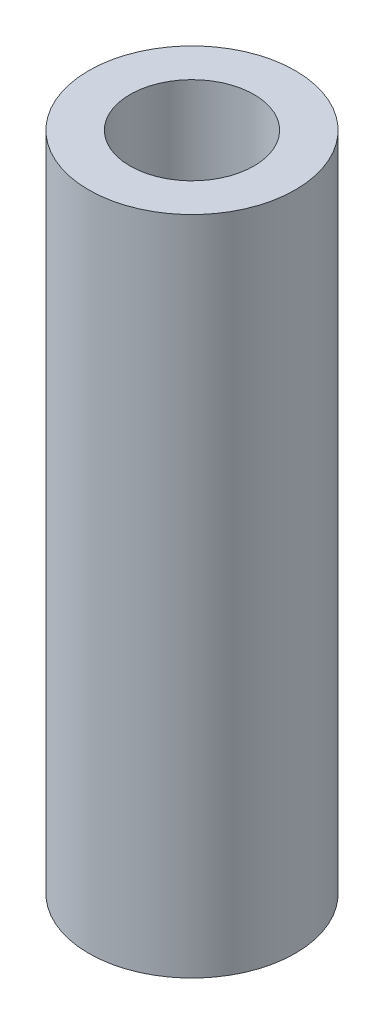
ISO-10303-21;
HEADER;
FILE_DESCRIPTION(('STEP AP214'),'2;1');
FILE_NAME('part.step','',(''),(''),'','','');
FILE_SCHEMA(('AUTOMOTIVE_DESIGN { 1 0 10303 214 1 1 1 1 }'));
ENDSEC;
DATA;
#1=APPLICATION_CONTEXT('core data for automotive mechanical design processes');
#2=APPLICATION_PROTOCOL_DEFINITION('international standard','automotive_design',2000,#1);
#3=PRODUCT_CONTEXT('',#1,'mechanical');
#4=PRODUCT('Part','Part','',(#3));
#5=PRODUCT_RELATED_PRODUCT_CATEGORY('part','',(#4));
#6=PRODUCT_DEFINITION_FORMATION('','',#4);
#7=PRODUCT_DEFINITION_CONTEXT('part definition',#1,'design');
#8=PRODUCT_DEFINITION('design','',#6,#7);
#9=PRODUCT_DEFINITION_SHAPE('','',#8);
#10=(LENGTH_UNIT() NAMED_UNIT(*) SI_UNIT(.MILLI.,.METRE.));
#11=(NAMED_UNIT(*) PLANE_ANGLE_UNIT() SI_UNIT($,.RADIAN.));
#12=(NAMED_UNIT(*) SI_UNIT($,.STERADIAN.) SOLID_ANGLE_UNIT());
#13=UNCERTAINTY_MEASURE_WITH_UNIT(LENGTH_MEASURE(1.E-05),#10,'distance_accuracy_value','');
#14=(GEOMETRIC_REPRESENTATION_CONTEXT(3) GLOBAL_UNCERTAINTY_ASSIGNED_CONTEXT((#13)) GLOBAL_UNIT_ASSIGNED_CONTEXT((#10,
#11,#12)) REPRESENTATION_CONTEXT('',''));
#15=CARTESIAN_POINT('',(0.,0.,0.));
#16=DIRECTION('',(0.,0.,1.));
#17=DIRECTION('',(1.,0.,0.));
#18=AXIS2_PLACEMENT_3D('',#15,#16,#17);
#19=CARTESIAN_POINT('',(0.,-50.8,0.));
#20=DIRECTION('',(0.,1.,0.));
#21=DIRECTION('',(0.,0.,1.));
#22=AXIS2_PLACEMENT_3D('',#19,#20,#21);
#23=CYLINDRICAL_SURFACE('',#22,7.9375);
#24=CARTESIAN_POINT('',(0.,-50.8,0.));
#25=DIRECTION('',(0.,1.,0.));
#26=DIRECTION('',(0.,0.,1.));
#27=AXIS2_PLACEMENT_3D('',#24,#25,#26);
#28=CIRCLE('',#27,7.9375);
#29=CARTESIAN_POINT('',(0.,-50.8,7.9375));
#30=VERTEX_POINT('',#29);
#31=EDGE_CURVE('E11',#30,#30,#28,.T.);
#32=ORIENTED_EDGE('',*,*,#31,.T.);
#33=EDGE_LOOP('',(#32));
#34=FACE_BOUND('',#33,.T.);
#35=CARTESIAN_POINT('',(0.,0.,0.));
#36=DIRECTION('',(0.,1.,0.));
#37=DIRECTION('',(0.,0.,1.));
#38=AXIS2_PLACEMENT_3D('',#35,#36,#37);
#39=CIRCLE('',#38,7.9375);
#40=CARTESIAN_POINT('',(0.,0.,7.9375));
#41=VERTEX_POINT('',#40);
#42=EDGE_CURVE('E40',#41,#41,#39,.T.);
#43=ORIENTED_EDGE('',*,*,#42,.F.);
#44=EDGE_LOOP('',(#43));
#45=FACE_BOUND('',#44,.T.);
#46=ADVANCED_FACE('F37',(#34,#45),#23,.T.);
#47=CARTESIAN_POINT('',(0.,-50.8,0.));
#48=DIRECTION('',(0.,1.,0.));
#49=DIRECTION('',(0.,0.,1.));
#50=AXIS2_PLACEMENT_3D('',#47,#48,#49);
#51=PLANE('',#50);
#52=ORIENTED_EDGE('',*,*,#31,.F.);
#53=EDGE_LOOP('',(#52));
#54=FACE_BOUND('',#53,.T.);
#55=ADVANCED_FACE('F60',(#54),#51,.F.);
#56=CARTESIAN_POINT('',(0.,0.,0.));
#57=DIRECTION('',(0.,1.,0.));
#58=DIRECTION('',(0.,0.,1.));
#59=AXIS2_PLACEMENT_3D('',#56,#57,#58);
#60=PLANE('',#59);
#61=CARTESIAN_POINT('',(0.,0.,0.));
#62=DIRECTION('',(0.,1.,0.));
#63=DIRECTION('',(0.,0.,1.));
#64=AXIS2_PLACEMENT_3D('',#61,#62,#63);
#65=CIRCLE('',#64,4.7625);
#66=CARTESIAN_POINT('',(0.,0.,4.7625));
#67=VERTEX_POINT('',#66);
#68=EDGE_CURVE('E51',#67,#67,#65,.T.);
#69=ORIENTED_EDGE('',*,*,#68,.F.);
#70=EDGE_LOOP('',(#69));
#71=FACE_BOUND('',#70,.T.);
#72=ORIENTED_EDGE('',*,*,#42,.T.);
#73=EDGE_LOOP('',(#72));
#74=FACE_BOUND('',#73,.T.);
#75=ADVANCED_FACE('F57',(#71,#74),#60,.T.);
#76=CARTESIAN_POINT('',(0.,-64.2703841816037,0.));
#77=DIRECTION('',(0.,1.,0.));
#78=DIRECTION('',(0.,0.,1.));
#79=AXIS2_PLACEMENT_3D('',#76,#77,#78);
#80=CYLINDRICAL_SURFACE('',#79,4.7625);
#81=CARTESIAN_POINT('',(0.,-44.45,0.));
#82=DIRECTION('',(0.,1.,0.));
#83=DIRECTION('',(0.,0.,1.));
#84=AXIS2_PLACEMENT_3D('',#81,#82,#83);
#85=CIRCLE('',#84,4.7625);
#86=CARTESIAN_POINT('',(0.,-44.45,4.7625));
#87=VERTEX_POINT('',#86);
#88=EDGE_CURVE('E47',#87,#87,#85,.F.);
#89=ORIENTED_EDGE('',*,*,#88,.T.);
#90=EDGE_LOOP('',(#89));
#91=FACE_BOUND('',#90,.T.);
#92=ORIENTED_EDGE('',*,*,#68,.T.);
#93=EDGE_LOOP('',(#92));
#94=FACE_BOUND('',#93,.T.);
#95=ADVANCED_FACE('F55',(#91,#94),#80,.F.);
#96=CARTESIAN_POINT('',(0.,-44.45,0.));
#97=DIRECTION('',(0.,1.,0.));
#98=DIRECTION('',(0.,0.,1.));
#99=AXIS2_PLACEMENT_3D('',#96,#97,#98);
#100=PLANE('',#99);
#101=ORIENTED_EDGE('',*,*,#88,.F.);
#102=EDGE_LOOP('',(#101));
#103=FACE_BOUND('',#102,.T.);
#104=ADVANCED_FACE('F74',(#103),#100,.T.);
#105=CLOSED_SHELL('',(#46,#55,#75,#95,#104));
#106=MANIFOLD_SOLID_BREP('B2',#105);
#107=ADVANCED_BREP_SHAPE_REPRESENTATION('',(#18,#106),#14);
#108=SHAPE_DEFINITION_REPRESENTATION(#9,#107);
ENDSEC;
END-ISO-10303-21;
